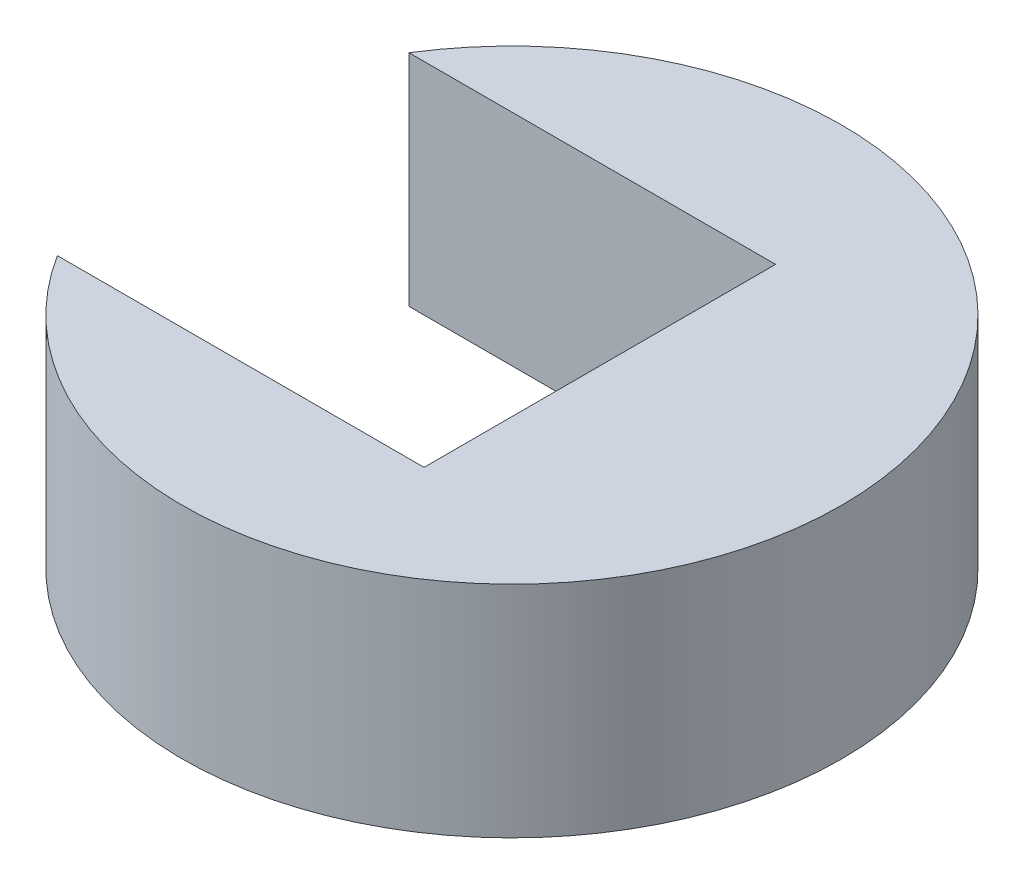
ISO-10303-21;
HEADER;
FILE_DESCRIPTION(('STEP AP214'),'2;1');
FILE_NAME('part.step','',(''),(''),'','','');
FILE_SCHEMA(('AUTOMOTIVE_DESIGN { 1 0 10303 214 1 1 1 1 }'));
ENDSEC;
DATA;
#1=APPLICATION_CONTEXT('core data for automotive mechanical design processes');
#2=APPLICATION_PROTOCOL_DEFINITION('international standard','automotive_design',2000,#1);
#3=PRODUCT_CONTEXT('',#1,'mechanical');
#4=PRODUCT('Part','Part','',(#3));
#5=PRODUCT_RELATED_PRODUCT_CATEGORY('part','',(#4));
#6=PRODUCT_DEFINITION_FORMATION('','',#4);
#7=PRODUCT_DEFINITION_CONTEXT('part definition',#1,'design');
#8=PRODUCT_DEFINITION('design','',#6,#7);
#9=PRODUCT_DEFINITION_SHAPE('','',#8);
#10=(LENGTH_UNIT() NAMED_UNIT(*) SI_UNIT(.MILLI.,.METRE.));
#11=(NAMED_UNIT(*) PLANE_ANGLE_UNIT() SI_UNIT($,.RADIAN.));
#12=(NAMED_UNIT(*) SI_UNIT($,.STERADIAN.) SOLID_ANGLE_UNIT());
#13=UNCERTAINTY_MEASURE_WITH_UNIT(LENGTH_MEASURE(1.E-05),#10,'distance_accuracy_value','');
#14=(GEOMETRIC_REPRESENTATION_CONTEXT(3) GLOBAL_UNCERTAINTY_ASSIGNED_CONTEXT((#13)) GLOBAL_UNIT_ASSIGNED_CONTEXT((#10,
#11,#12)) REPRESENTATION_CONTEXT('',''));
#15=CARTESIAN_POINT('',(0.,0.,0.));
#16=DIRECTION('',(0.,0.,1.));
#17=DIRECTION('',(1.,0.,0.));
#18=AXIS2_PLACEMENT_3D('',#15,#16,#17);
#19=CARTESIAN_POINT('',(4.,10.,0.));
#20=DIRECTION('',(0.,1.,0.));
#21=DIRECTION('',(0.,0.,1.));
#22=AXIS2_PLACEMENT_3D('',#19,#20,#21);
#23=PLANE('',#22);
#24=DIRECTION('',(-1.,0.,0.));
#25=VECTOR('',#24,1.);
#26=CARTESIAN_POINT('',(8.,10.,8.));
#27=LINE('',#26,#25);
#28=CARTESIAN_POINT('',(8.,10.,8.));
#29=VERTEX_POINT('',#28);
#30=CARTESIAN_POINT('',(-8.68857754044952,10.,8.));
#31=VERTEX_POINT('',#30);
#32=EDGE_CURVE('E80',#29,#31,#27,.T.);
#33=ORIENTED_EDGE('',*,*,#32,.T.);
#34=CARTESIAN_POINT('',(4.,10.,0.));
#35=DIRECTION('',(0.,1.,0.));
#36=DIRECTION('',(0.,0.,1.));
#37=AXIS2_PLACEMENT_3D('',#34,#35,#36);
#38=CIRCLE('',#37,15.);
#39=CARTESIAN_POINT('',(-8.68857754044952,10.,-8.));
#40=VERTEX_POINT('',#39);
#41=EDGE_CURVE('E89',#31,#40,#38,.T.);
#42=ORIENTED_EDGE('',*,*,#41,.T.);
#43=DIRECTION('',(1.,0.,0.));
#44=VECTOR('',#43,1.);
#45=CARTESIAN_POINT('',(8.,10.,-8.));
#46=LINE('',#45,#44);
#47=CARTESIAN_POINT('',(8.,10.,-8.));
#48=VERTEX_POINT('',#47);
#49=EDGE_CURVE('E48',#40,#48,#46,.T.);
#50=ORIENTED_EDGE('',*,*,#49,.T.);
#51=DIRECTION('',(0.,0.,1.));
#52=VECTOR('',#51,1.);
#53=CARTESIAN_POINT('',(8.,10.,-8.));
#54=LINE('',#53,#52);
#55=EDGE_CURVE('E83',#48,#29,#54,.T.);
#56=ORIENTED_EDGE('',*,*,#55,.T.);
#57=EDGE_LOOP('',(#33,#42,#50,#56));
#58=FACE_BOUND('',#57,.T.);
#59=ADVANCED_FACE('F33',(#58),#23,.T.);
#60=CARTESIAN_POINT('',(4.,0.,0.));
#61=DIRECTION('',(0.,1.,0.));
#62=DIRECTION('',(0.,0.,1.));
#63=AXIS2_PLACEMENT_3D('',#60,#61,#62);
#64=PLANE('',#63);
#65=CARTESIAN_POINT('',(4.,0.,0.));
#66=DIRECTION('',(0.,1.,0.));
#67=DIRECTION('',(0.,0.,1.));
#68=AXIS2_PLACEMENT_3D('',#65,#66,#67);
#69=CIRCLE('',#68,15.);
#70=CARTESIAN_POINT('',(-8.68857754044952,0.,8.));
#71=VERTEX_POINT('',#70);
#72=CARTESIAN_POINT('',(-8.68857754044952,0.,-8.));
#73=VERTEX_POINT('',#72);
#74=EDGE_CURVE('E98',#71,#73,#69,.T.);
#75=ORIENTED_EDGE('',*,*,#74,.F.);
#76=DIRECTION('',(-1.,0.,0.));
#77=VECTOR('',#76,1.);
#78=CARTESIAN_POINT('',(8.,0.,8.));
#79=LINE('',#78,#77);
#80=CARTESIAN_POINT('',(8.,0.,8.));
#81=VERTEX_POINT('',#80);
#82=EDGE_CURVE('E90',#81,#71,#79,.T.);
#83=ORIENTED_EDGE('',*,*,#82,.F.);
#84=DIRECTION('',(0.,0.,1.));
#85=VECTOR('',#84,1.);
#86=CARTESIAN_POINT('',(8.,0.,-8.));
#87=LINE('',#86,#85);
#88=CARTESIAN_POINT('',(8.,0.,-8.));
#89=VERTEX_POINT('',#88);
#90=EDGE_CURVE('E92',#89,#81,#87,.T.);
#91=ORIENTED_EDGE('',*,*,#90,.F.);
#92=DIRECTION('',(1.,0.,0.));
#93=VECTOR('',#92,1.);
#94=CARTESIAN_POINT('',(8.,0.,-8.));
#95=LINE('',#94,#93);
#96=EDGE_CURVE('E75',#73,#89,#95,.T.);
#97=ORIENTED_EDGE('',*,*,#96,.F.);
#98=EDGE_LOOP('',(#75,#83,#91,#97));
#99=FACE_BOUND('',#98,.T.);
#100=ADVANCED_FACE('F105',(#99),#64,.F.);
#101=CARTESIAN_POINT('',(4.,10.,0.));
#102=DIRECTION('',(0.,-1.,0.));
#103=DIRECTION('',(0.,0.,-1.));
#104=AXIS2_PLACEMENT_3D('',#101,#102,#103);
#105=CYLINDRICAL_SURFACE('',#104,15.);
#106=ORIENTED_EDGE('',*,*,#41,.F.);
#107=DIRECTION('',(0.,-1.,0.));
#108=VECTOR('',#107,1.);
#109=CARTESIAN_POINT('',(-8.68857754044952,10.,8.));
#110=LINE('',#109,#108);
#111=EDGE_CURVE('E11',#31,#71,#110,.T.);
#112=ORIENTED_EDGE('',*,*,#111,.T.);
#113=ORIENTED_EDGE('',*,*,#74,.T.);
#114=DIRECTION('',(0.,-1.,0.));
#115=VECTOR('',#114,1.);
#116=CARTESIAN_POINT('',(-8.68857754044952,10.,-8.));
#117=LINE('',#116,#115);
#118=EDGE_CURVE('E41',#73,#40,#117,.F.);
#119=ORIENTED_EDGE('',*,*,#118,.T.);
#120=EDGE_LOOP('',(#106,#112,#113,#119));
#121=FACE_BOUND('',#120,.T.);
#122=ADVANCED_FACE('F35',(#121),#105,.T.);
#123=CARTESIAN_POINT('',(8.,10.,8.));
#124=DIRECTION('',(0.,0.,1.));
#125=DIRECTION('',(1.,0.,0.));
#126=AXIS2_PLACEMENT_3D('',#123,#124,#125);
#127=PLANE('',#126);
#128=ORIENTED_EDGE('',*,*,#32,.F.);
#129=DIRECTION('',(0.,-1.,0.));
#130=VECTOR('',#129,1.);
#131=CARTESIAN_POINT('',(8.,10.,8.));
#132=LINE('',#131,#130);
#133=EDGE_CURVE('E79',#29,#81,#132,.T.);
#134=ORIENTED_EDGE('',*,*,#133,.T.);
#135=ORIENTED_EDGE('',*,*,#82,.T.);
#136=ORIENTED_EDGE('',*,*,#111,.F.);
#137=EDGE_LOOP('',(#128,#134,#135,#136));
#138=FACE_BOUND('',#137,.T.);
#139=ADVANCED_FACE('F107',(#138),#127,.F.);
#140=CARTESIAN_POINT('',(8.,10.,-8.));
#141=DIRECTION('',(0.,0.,-1.));
#142=DIRECTION('',(-1.,0.,0.));
#143=AXIS2_PLACEMENT_3D('',#140,#141,#142);
#144=PLANE('',#143);
#145=ORIENTED_EDGE('',*,*,#96,.T.);
#146=DIRECTION('',(0.,-1.,0.));
#147=VECTOR('',#146,1.);
#148=CARTESIAN_POINT('',(8.,10.,-8.));
#149=LINE('',#148,#147);
#150=EDGE_CURVE('E71',#48,#89,#149,.T.);
#151=ORIENTED_EDGE('',*,*,#150,.F.);
#152=ORIENTED_EDGE('',*,*,#49,.F.);
#153=ORIENTED_EDGE('',*,*,#118,.F.);
#154=EDGE_LOOP('',(#145,#151,#152,#153));
#155=FACE_BOUND('',#154,.T.);
#156=ADVANCED_FACE('F73',(#155),#144,.F.);
#157=CARTESIAN_POINT('',(8.,10.,-8.));
#158=DIRECTION('',(1.,0.,0.));
#159=DIRECTION('',(0.,0.,-1.));
#160=AXIS2_PLACEMENT_3D('',#157,#158,#159);
#161=PLANE('',#160);
#162=ORIENTED_EDGE('',*,*,#90,.T.);
#163=ORIENTED_EDGE('',*,*,#133,.F.);
#164=ORIENTED_EDGE('',*,*,#55,.F.);
#165=ORIENTED_EDGE('',*,*,#150,.T.);
#166=EDGE_LOOP('',(#162,#163,#164,#165));
#167=FACE_BOUND('',#166,.T.);
#168=ADVANCED_FACE('F84',(#167),#161,.F.);
#169=CLOSED_SHELL('',(#59,#100,#122,#139,#156,#168));
#170=MANIFOLD_SOLID_BREP('B2',#169);
#171=ADVANCED_BREP_SHAPE_REPRESENTATION('',(#18,#170),#14);
#172=SHAPE_DEFINITION_REPRESENTATION(#9,#171);
ENDSEC;
END-ISO-10303-21;
